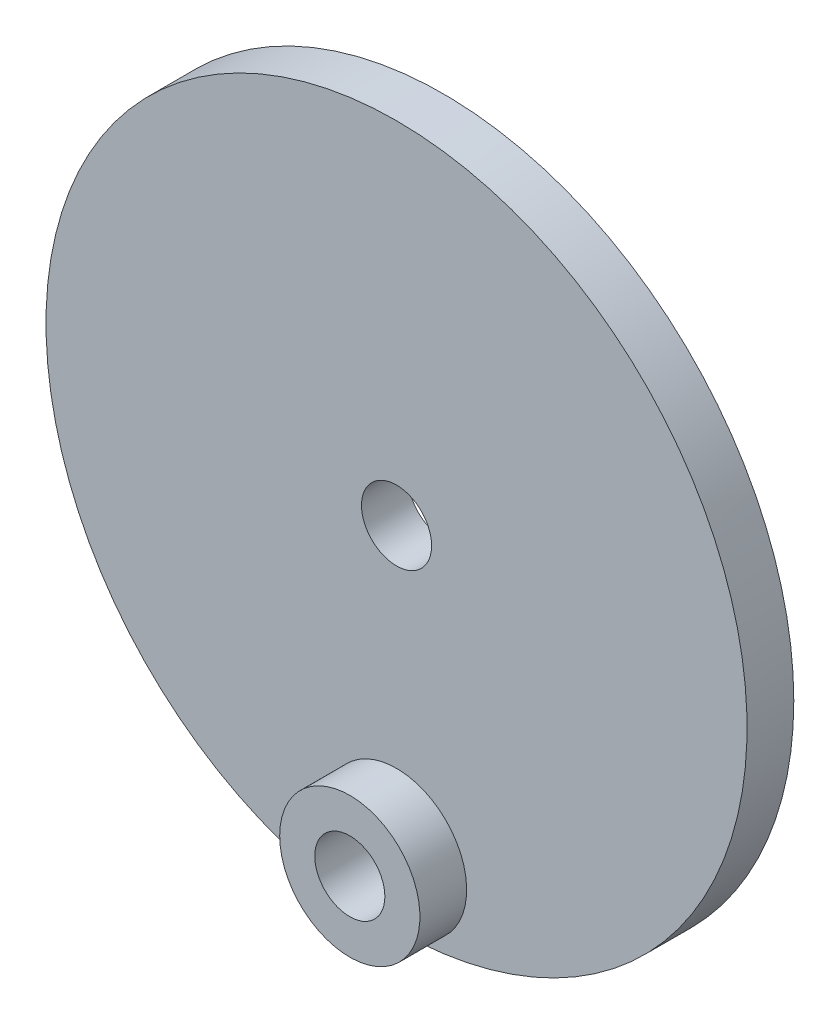
ISO-10303-21;
HEADER;
FILE_DESCRIPTION(('STEP AP214'),'2;1');
FILE_NAME('part.step','',(''),(''),'','','');
FILE_SCHEMA(('AUTOMOTIVE_DESIGN { 1 0 10303 214 1 1 1 1 }'));
ENDSEC;
DATA;
#1=APPLICATION_CONTEXT('core data for automotive mechanical design processes');
#2=APPLICATION_PROTOCOL_DEFINITION('international standard','automotive_design',2000,#1);
#3=PRODUCT_CONTEXT('',#1,'mechanical');
#4=PRODUCT('Part','Part','',(#3));
#5=PRODUCT_RELATED_PRODUCT_CATEGORY('part','',(#4));
#6=PRODUCT_DEFINITION_FORMATION('','',#4);
#7=PRODUCT_DEFINITION_CONTEXT('part definition',#1,'design');
#8=PRODUCT_DEFINITION('design','',#6,#7);
#9=PRODUCT_DEFINITION_SHAPE('','',#8);
#10=(LENGTH_UNIT() NAMED_UNIT(*) SI_UNIT(.MILLI.,.METRE.));
#11=(NAMED_UNIT(*) PLANE_ANGLE_UNIT() SI_UNIT($,.RADIAN.));
#12=(NAMED_UNIT(*) SI_UNIT($,.STERADIAN.) SOLID_ANGLE_UNIT());
#13=UNCERTAINTY_MEASURE_WITH_UNIT(LENGTH_MEASURE(1.E-05),#10,'distance_accuracy_value','');
#14=(GEOMETRIC_REPRESENTATION_CONTEXT(3) GLOBAL_UNCERTAINTY_ASSIGNED_CONTEXT((#13)) GLOBAL_UNIT_ASSIGNED_CONTEXT((#10,
#11,#12)) REPRESENTATION_CONTEXT('',''));
#15=CARTESIAN_POINT('',(0.,0.,0.));
#16=DIRECTION('',(0.,0.,1.));
#17=DIRECTION('',(1.,0.,0.));
#18=AXIS2_PLACEMENT_3D('',#15,#16,#17);
#19=CARTESIAN_POINT('',(0.,0.,2.));
#20=DIRECTION('',(0.,0.,-1.));
#21=DIRECTION('',(-1.,0.,0.));
#22=AXIS2_PLACEMENT_3D('',#19,#20,#21);
#23=CYLINDRICAL_SURFACE('',#22,15.);
#24=CARTESIAN_POINT('',(0.,0.,0.));
#25=DIRECTION('',(0.,0.,1.));
#26=DIRECTION('',(1.,0.,0.));
#27=AXIS2_PLACEMENT_3D('',#24,#25,#26);
#28=CIRCLE('',#27,15.);
#29=CARTESIAN_POINT('',(15.,0.,0.));
#30=VERTEX_POINT('',#29);
#31=EDGE_CURVE('E39',#30,#30,#28,.T.);
#32=ORIENTED_EDGE('',*,*,#31,.T.);
#33=EDGE_LOOP('',(#32));
#34=FACE_BOUND('',#33,.T.);
#35=CARTESIAN_POINT('',(0.,0.,2.));
#36=DIRECTION('',(0.,0.,1.));
#37=DIRECTION('',(1.,0.,0.));
#38=AXIS2_PLACEMENT_3D('',#35,#36,#37);
#39=CIRCLE('',#38,15.);
#40=CARTESIAN_POINT('',(0.,-15.,2.));
#41=VERTEX_POINT('',#40);
#42=EDGE_CURVE('E11',#41,#41,#39,.T.);
#43=ORIENTED_EDGE('',*,*,#42,.F.);
#44=EDGE_LOOP('',(#43));
#45=FACE_BOUND('',#44,.T.);
#46=ADVANCED_FACE('F32',(#34,#45),#23,.T.);
#47=CARTESIAN_POINT('',(0.,0.,2.));
#48=DIRECTION('',(0.,0.,1.));
#49=DIRECTION('',(1.,0.,0.));
#50=AXIS2_PLACEMENT_3D('',#47,#48,#49);
#51=PLANE('',#50);
#52=CARTESIAN_POINT('',(0.,0.,2.));
#53=DIRECTION('',(0.,0.,1.));
#54=DIRECTION('',(1.,0.,0.));
#55=AXIS2_PLACEMENT_3D('',#52,#53,#54);
#56=CIRCLE('',#55,1.5);
#57=CARTESIAN_POINT('',(1.5,0.,2.));
#58=VERTEX_POINT('',#57);
#59=EDGE_CURVE('E52',#58,#58,#56,.T.);
#60=ORIENTED_EDGE('',*,*,#59,.F.);
#61=EDGE_LOOP('',(#60));
#62=FACE_BOUND('',#61,.T.);
#63=ORIENTED_EDGE('',*,*,#42,.T.);
#64=CARTESIAN_POINT('',(0.,-12.,2.));
#65=DIRECTION('',(0.,0.,1.));
#66=DIRECTION('',(1.,0.,0.));
#67=AXIS2_PLACEMENT_3D('',#64,#65,#66);
#68=CIRCLE('',#67,3.);
#69=EDGE_CURVE('E47',#41,#41,#68,.T.);
#70=ORIENTED_EDGE('',*,*,#69,.F.);
#71=EDGE_LOOP('',(#63,#70));
#72=FACE_BOUND('',#71,.T.);
#73=ADVANCED_FACE('F45',(#62,#72),#51,.T.);
#74=CARTESIAN_POINT('',(0.,0.,0.));
#75=DIRECTION('',(0.,0.,1.));
#76=DIRECTION('',(1.,0.,0.));
#77=AXIS2_PLACEMENT_3D('',#74,#75,#76);
#78=PLANE('',#77);
#79=CARTESIAN_POINT('',(0.,0.,0.));
#80=DIRECTION('',(0.,0.,1.));
#81=DIRECTION('',(1.,0.,0.));
#82=AXIS2_PLACEMENT_3D('',#79,#80,#81);
#83=CIRCLE('',#82,1.5);
#84=CARTESIAN_POINT('',(1.5,0.,0.));
#85=VERTEX_POINT('',#84);
#86=EDGE_CURVE('E59',#85,#85,#83,.T.);
#87=ORIENTED_EDGE('',*,*,#86,.T.);
#88=EDGE_LOOP('',(#87));
#89=FACE_BOUND('',#88,.T.);
#90=ORIENTED_EDGE('',*,*,#31,.F.);
#91=EDGE_LOOP('',(#90));
#92=FACE_BOUND('',#91,.T.);
#93=CARTESIAN_POINT('',(0.,-12.,0.));
#94=DIRECTION('',(0.,0.,1.));
#95=DIRECTION('',(1.,0.,0.));
#96=AXIS2_PLACEMENT_3D('',#93,#94,#95);
#97=CIRCLE('',#96,1.5);
#98=CARTESIAN_POINT('',(1.5,-12.,0.));
#99=VERTEX_POINT('',#98);
#100=EDGE_CURVE('E35',#99,#99,#97,.T.);
#101=ORIENTED_EDGE('',*,*,#100,.T.);
#102=EDGE_LOOP('',(#101));
#103=FACE_BOUND('',#102,.T.);
#104=ADVANCED_FACE('F65',(#89,#92,#103),#78,.F.);
#105=CARTESIAN_POINT('',(0.,0.,-1.));
#106=DIRECTION('',(0.,0.,1.));
#107=DIRECTION('',(1.,0.,0.));
#108=AXIS2_PLACEMENT_3D('',#105,#106,#107);
#109=CYLINDRICAL_SURFACE('',#108,1.5);
#110=ORIENTED_EDGE('',*,*,#59,.T.);
#111=EDGE_LOOP('',(#110));
#112=FACE_BOUND('',#111,.T.);
#113=ORIENTED_EDGE('',*,*,#86,.F.);
#114=EDGE_LOOP('',(#113));
#115=FACE_BOUND('',#114,.T.);
#116=ADVANCED_FACE('F68',(#112,#115),#109,.F.);
#117=CARTESIAN_POINT('',(0.,-12.,-1.));
#118=DIRECTION('',(0.,0.,1.));
#119=DIRECTION('',(1.,0.,0.));
#120=AXIS2_PLACEMENT_3D('',#117,#118,#119);
#121=CYLINDRICAL_SURFACE('',#120,1.5);
#122=ORIENTED_EDGE('',*,*,#100,.F.);
#123=EDGE_LOOP('',(#122));
#124=FACE_BOUND('',#123,.T.);
#125=CARTESIAN_POINT('',(0.,-12.,4.));
#126=DIRECTION('',(0.,0.,-1.));
#127=DIRECTION('',(-1.,0.,0.));
#128=AXIS2_PLACEMENT_3D('',#125,#126,#127);
#129=CIRCLE('',#128,1.5);
#130=CARTESIAN_POINT('',(-1.5,-12.,4.));
#131=VERTEX_POINT('',#130);
#132=EDGE_CURVE('E54',#131,#131,#129,.T.);
#133=ORIENTED_EDGE('',*,*,#132,.F.);
#134=EDGE_LOOP('',(#133));
#135=FACE_BOUND('',#134,.T.);
#136=ADVANCED_FACE('F70',(#124,#135),#121,.F.);
#137=CARTESIAN_POINT('',(0.,-12.,4.));
#138=DIRECTION('',(0.,0.,-1.));
#139=DIRECTION('',(-1.,0.,0.));
#140=AXIS2_PLACEMENT_3D('',#137,#138,#139);
#141=CYLINDRICAL_SURFACE('',#140,3.);
#142=ORIENTED_EDGE('',*,*,#69,.T.);
#143=EDGE_LOOP('',(#142));
#144=FACE_BOUND('',#143,.T.);
#145=CARTESIAN_POINT('',(0.,-12.,4.));
#146=DIRECTION('',(0.,0.,-1.));
#147=DIRECTION('',(-1.,0.,0.));
#148=AXIS2_PLACEMENT_3D('',#145,#146,#147);
#149=CIRCLE('',#148,3.);
#150=CARTESIAN_POINT('',(-3.,-12.,4.));
#151=VERTEX_POINT('',#150);
#152=EDGE_CURVE('E49',#151,#151,#149,.T.);
#153=ORIENTED_EDGE('',*,*,#152,.T.);
#154=EDGE_LOOP('',(#153));
#155=FACE_BOUND('',#154,.T.);
#156=ADVANCED_FACE('F77',(#144,#155),#141,.T.);
#157=CARTESIAN_POINT('',(0.,-12.,4.));
#158=DIRECTION('',(0.,0.,-1.));
#159=DIRECTION('',(-1.,0.,0.));
#160=AXIS2_PLACEMENT_3D('',#157,#158,#159);
#161=PLANE('',#160);
#162=ORIENTED_EDGE('',*,*,#132,.T.);
#163=EDGE_LOOP('',(#162));
#164=FACE_BOUND('',#163,.T.);
#165=ORIENTED_EDGE('',*,*,#152,.F.);
#166=EDGE_LOOP('',(#165));
#167=FACE_BOUND('',#166,.T.);
#168=ADVANCED_FACE('F94',(#164,#167),#161,.F.);
#169=CLOSED_SHELL('',(#46,#73,#104,#116,#136,#156,#168));
#170=MANIFOLD_SOLID_BREP('B2',#169);
#171=ADVANCED_BREP_SHAPE_REPRESENTATION('',(#18,#170),#14);
#172=SHAPE_DEFINITION_REPRESENTATION(#9,#171);
ENDSEC;
END-ISO-10303-21;
